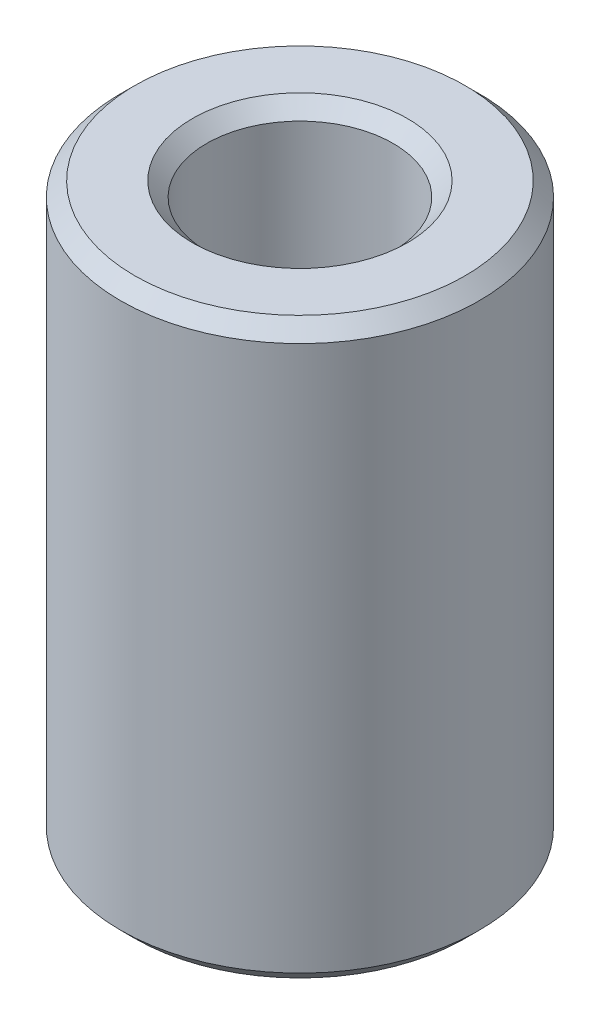
ISO-10303-21;
HEADER;
FILE_DESCRIPTION(('STEP AP214'),'2;1');
FILE_NAME('part.step','',(''),(''),'','','');
FILE_SCHEMA(('AUTOMOTIVE_DESIGN { 1 0 10303 214 1 1 1 1 }'));
ENDSEC;
DATA;
#1=APPLICATION_CONTEXT('core data for automotive mechanical design processes');
#2=APPLICATION_PROTOCOL_DEFINITION('international standard','automotive_design',2000,#1);
#3=PRODUCT_CONTEXT('',#1,'mechanical');
#4=PRODUCT('Part','Part','',(#3));
#5=PRODUCT_RELATED_PRODUCT_CATEGORY('part','',(#4));
#6=PRODUCT_DEFINITION_FORMATION('','',#4);
#7=PRODUCT_DEFINITION_CONTEXT('part definition',#1,'design');
#8=PRODUCT_DEFINITION('design','',#6,#7);
#9=PRODUCT_DEFINITION_SHAPE('','',#8);
#10=(LENGTH_UNIT() NAMED_UNIT(*) SI_UNIT(.MILLI.,.METRE.));
#11=(NAMED_UNIT(*) PLANE_ANGLE_UNIT() SI_UNIT($,.RADIAN.));
#12=(NAMED_UNIT(*) SI_UNIT($,.STERADIAN.) SOLID_ANGLE_UNIT());
#13=UNCERTAINTY_MEASURE_WITH_UNIT(LENGTH_MEASURE(1.E-05),#10,'distance_accuracy_value','');
#14=(GEOMETRIC_REPRESENTATION_CONTEXT(3) GLOBAL_UNCERTAINTY_ASSIGNED_CONTEXT((#13)) GLOBAL_UNIT_ASSIGNED_CONTEXT((#10,
#11,#12)) REPRESENTATION_CONTEXT('',''));
#15=CARTESIAN_POINT('',(0.,0.,0.));
#16=DIRECTION('',(0.,0.,1.));
#17=DIRECTION('',(1.,0.,0.));
#18=AXIS2_PLACEMENT_3D('',#15,#16,#17);
#19=CARTESIAN_POINT('',(0.,8.,0.));
#20=DIRECTION('',(0.,1.,0.));
#21=DIRECTION('',(0.,0.,1.));
#22=AXIS2_PLACEMENT_3D('',#19,#20,#21);
#23=PLANE('',#22);
#24=CARTESIAN_POINT('',(0.,8.,0.));
#25=DIRECTION('',(0.,1.,0.));
#26=DIRECTION('',(0.,0.,1.));
#27=AXIS2_PLACEMENT_3D('',#24,#25,#26);
#28=CIRCLE('',#27,2.3);
#29=CARTESIAN_POINT('',(0.,8.,2.3));
#30=VERTEX_POINT('',#29);
#31=EDGE_CURVE('E10',#30,#30,#28,.T.);
#32=ORIENTED_EDGE('',*,*,#31,.T.);
#33=EDGE_LOOP('',(#32));
#34=FACE_BOUND('',#33,.T.);
#35=CARTESIAN_POINT('',(0.,8.,0.));
#36=DIRECTION('',(0.,1.,0.));
#37=DIRECTION('',(0.,0.,1.));
#38=AXIS2_PLACEMENT_3D('',#35,#36,#37);
#39=CIRCLE('',#38,1.5);
#40=CARTESIAN_POINT('',(0.,8.,1.5));
#41=VERTEX_POINT('',#40);
#42=EDGE_CURVE('E43',#41,#41,#39,.F.);
#43=ORIENTED_EDGE('',*,*,#42,.T.);
#44=EDGE_LOOP('',(#43));
#45=FACE_BOUND('',#44,.T.);
#46=ADVANCED_FACE('F36',(#34,#45),#23,.T.);
#47=CARTESIAN_POINT('',(0.,0.,0.));
#48=DIRECTION('',(0.,1.,0.));
#49=DIRECTION('',(0.,0.,1.));
#50=AXIS2_PLACEMENT_3D('',#47,#48,#49);
#51=PLANE('',#50);
#52=CARTESIAN_POINT('',(0.,0.,0.));
#53=DIRECTION('',(0.,1.,0.));
#54=DIRECTION('',(0.,0.,1.));
#55=AXIS2_PLACEMENT_3D('',#52,#53,#54);
#56=CIRCLE('',#55,2.3);
#57=CARTESIAN_POINT('',(0.,0.,2.3));
#58=VERTEX_POINT('',#57);
#59=EDGE_CURVE('E56',#58,#58,#56,.F.);
#60=ORIENTED_EDGE('',*,*,#59,.T.);
#61=EDGE_LOOP('',(#60));
#62=FACE_BOUND('',#61,.T.);
#63=CARTESIAN_POINT('',(0.,0.,0.));
#64=DIRECTION('',(0.,1.,0.));
#65=DIRECTION('',(0.,0.,1.));
#66=AXIS2_PLACEMENT_3D('',#63,#64,#65);
#67=CIRCLE('',#66,1.5);
#68=CARTESIAN_POINT('',(0.,0.,1.5));
#69=VERTEX_POINT('',#68);
#70=EDGE_CURVE('E59',#69,#69,#67,.T.);
#71=ORIENTED_EDGE('',*,*,#70,.T.);
#72=EDGE_LOOP('',(#71));
#73=FACE_BOUND('',#72,.T.);
#74=ADVANCED_FACE('F84',(#62,#73),#51,.F.);
#75=CARTESIAN_POINT('',(0.,8.,0.));
#76=DIRECTION('',(0.,-1.,0.));
#77=DIRECTION('',(0.,0.,-1.));
#78=AXIS2_PLACEMENT_3D('',#75,#76,#77);
#79=CYLINDRICAL_SURFACE('',#78,2.5);
#80=CARTESIAN_POINT('',(0.,0.200000000000001,0.));
#81=DIRECTION('',(0.,1.,0.));
#82=DIRECTION('',(0.,0.,1.));
#83=AXIS2_PLACEMENT_3D('',#80,#81,#82);
#84=CIRCLE('',#83,2.5);
#85=CARTESIAN_POINT('',(0.,0.200000000000001,2.5));
#86=VERTEX_POINT('',#85);
#87=EDGE_CURVE('E62',#86,#86,#84,.T.);
#88=ORIENTED_EDGE('',*,*,#87,.T.);
#89=EDGE_LOOP('',(#88));
#90=FACE_BOUND('',#89,.T.);
#91=CARTESIAN_POINT('',(0.,7.8,0.));
#92=DIRECTION('',(0.,1.,0.));
#93=DIRECTION('',(0.,0.,1.));
#94=AXIS2_PLACEMENT_3D('',#91,#92,#93);
#95=CIRCLE('',#94,2.5);
#96=CARTESIAN_POINT('',(0.,7.8,2.5));
#97=VERTEX_POINT('',#96);
#98=EDGE_CURVE('E65',#97,#97,#95,.F.);
#99=ORIENTED_EDGE('',*,*,#98,.T.);
#100=EDGE_LOOP('',(#99));
#101=FACE_BOUND('',#100,.T.);
#102=ADVANCED_FACE('F69',(#90,#101),#79,.T.);
#103=CARTESIAN_POINT('',(0.,8.,0.));
#104=DIRECTION('',(0.,-1.,0.));
#105=DIRECTION('',(0.,0.,-1.));
#106=AXIS2_PLACEMENT_3D('',#103,#104,#105);
#107=CYLINDRICAL_SURFACE('',#106,1.3);
#108=CARTESIAN_POINT('',(0.,0.200000000000001,0.));
#109=DIRECTION('',(0.,1.,0.));
#110=DIRECTION('',(0.,0.,1.));
#111=AXIS2_PLACEMENT_3D('',#108,#109,#110);
#112=CIRCLE('',#111,1.3);
#113=CARTESIAN_POINT('',(0.,0.200000000000001,1.3));
#114=VERTEX_POINT('',#113);
#115=EDGE_CURVE('E47',#114,#114,#112,.F.);
#116=ORIENTED_EDGE('',*,*,#115,.T.);
#117=EDGE_LOOP('',(#116));
#118=FACE_BOUND('',#117,.T.);
#119=CARTESIAN_POINT('',(0.,7.8,0.));
#120=DIRECTION('',(0.,1.,0.));
#121=DIRECTION('',(0.,0.,1.));
#122=AXIS2_PLACEMENT_3D('',#119,#120,#121);
#123=CIRCLE('',#122,1.3);
#124=CARTESIAN_POINT('',(0.,7.8,1.3));
#125=VERTEX_POINT('',#124);
#126=EDGE_CURVE('E51',#125,#125,#123,.T.);
#127=ORIENTED_EDGE('',*,*,#126,.T.);
#128=EDGE_LOOP('',(#127));
#129=FACE_BOUND('',#128,.T.);
#130=ADVANCED_FACE('F92',(#118,#129),#107,.F.);
#131=CARTESIAN_POINT('',(0.,0.200000000000001,0.));
#132=DIRECTION('',(0.,1.,0.));
#133=DIRECTION('',(0.,0.,1.));
#134=AXIS2_PLACEMENT_3D('',#131,#132,#133);
#135=CONICAL_SURFACE('',#134,2.5,0.785398163397452);
#136=ORIENTED_EDGE('',*,*,#59,.F.);
#137=EDGE_LOOP('',(#136));
#138=FACE_BOUND('',#137,.T.);
#139=ORIENTED_EDGE('',*,*,#87,.F.);
#140=EDGE_LOOP('',(#139));
#141=FACE_BOUND('',#140,.T.);
#142=ADVANCED_FACE('F80',(#138,#141),#135,.T.);
#143=CARTESIAN_POINT('',(0.,0.,0.));
#144=DIRECTION('',(0.,-1.,0.));
#145=DIRECTION('',(0.,0.,-1.));
#146=AXIS2_PLACEMENT_3D('',#143,#144,#145);
#147=CONICAL_SURFACE('',#146,1.5,0.785398163397446);
#148=ORIENTED_EDGE('',*,*,#115,.F.);
#149=EDGE_LOOP('',(#148));
#150=FACE_BOUND('',#149,.T.);
#151=ORIENTED_EDGE('',*,*,#70,.F.);
#152=EDGE_LOOP('',(#151));
#153=FACE_BOUND('',#152,.T.);
#154=ADVANCED_FACE('F74',(#150,#153),#147,.F.);
#155=CARTESIAN_POINT('',(0.,8.,0.));
#156=DIRECTION('',(0.,-1.,0.));
#157=DIRECTION('',(0.,0.,-1.));
#158=AXIS2_PLACEMENT_3D('',#155,#156,#157);
#159=CONICAL_SURFACE('',#158,2.3,0.785398163397445);
#160=ORIENTED_EDGE('',*,*,#98,.F.);
#161=EDGE_LOOP('',(#160));
#162=FACE_BOUND('',#161,.T.);
#163=ORIENTED_EDGE('',*,*,#31,.F.);
#164=EDGE_LOOP('',(#163));
#165=FACE_BOUND('',#164,.T.);
#166=ADVANCED_FACE('F71',(#162,#165),#159,.T.);
#167=CARTESIAN_POINT('',(0.,7.8,0.));
#168=DIRECTION('',(0.,1.,0.));
#169=DIRECTION('',(0.,0.,1.));
#170=AXIS2_PLACEMENT_3D('',#167,#168,#169);
#171=CONICAL_SURFACE('',#170,1.3,0.785398163397442);
#172=ORIENTED_EDGE('',*,*,#42,.F.);
#173=EDGE_LOOP('',(#172));
#174=FACE_BOUND('',#173,.T.);
#175=ORIENTED_EDGE('',*,*,#126,.F.);
#176=EDGE_LOOP('',(#175));
#177=FACE_BOUND('',#176,.T.);
#178=ADVANCED_FACE('F38',(#174,#177),#171,.F.);
#179=CLOSED_SHELL('',(#46,#74,#102,#130,#142,#154,#166,#178));
#180=MANIFOLD_SOLID_BREP('B2',#179);
#181=ADVANCED_BREP_SHAPE_REPRESENTATION('',(#18,#180),#14);
#182=SHAPE_DEFINITION_REPRESENTATION(#9,#181);
ENDSEC;
END-ISO-10303-21;
